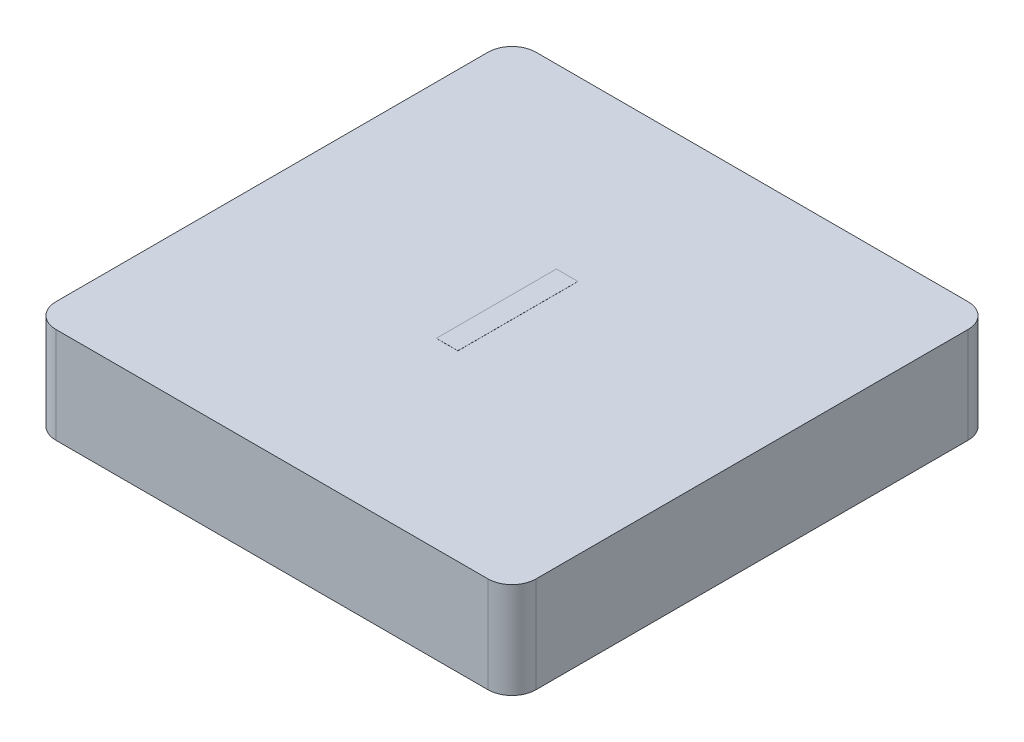
ISO-10303-21;
HEADER;
FILE_DESCRIPTION(('STEP AP214'),'2;1');
FILE_NAME('part.step','',(''),(''),'','','');
FILE_SCHEMA(('AUTOMOTIVE_DESIGN { 1 0 10303 214 1 1 1 1 }'));
ENDSEC;
DATA;
#1=APPLICATION_CONTEXT('core data for automotive mechanical design processes');
#2=APPLICATION_PROTOCOL_DEFINITION('international standard','automotive_design',2000,#1);
#3=PRODUCT_CONTEXT('',#1,'mechanical');
#4=PRODUCT('Part','Part','',(#3));
#5=PRODUCT_RELATED_PRODUCT_CATEGORY('part','',(#4));
#6=PRODUCT_DEFINITION_FORMATION('','',#4);
#7=PRODUCT_DEFINITION_CONTEXT('part definition',#1,'design');
#8=PRODUCT_DEFINITION('design','',#6,#7);
#9=PRODUCT_DEFINITION_SHAPE('','',#8);
#10=(LENGTH_UNIT() NAMED_UNIT(*) SI_UNIT(.MILLI.,.METRE.));
#11=(NAMED_UNIT(*) PLANE_ANGLE_UNIT() SI_UNIT($,.RADIAN.));
#12=(NAMED_UNIT(*) SI_UNIT($,.STERADIAN.) SOLID_ANGLE_UNIT());
#13=UNCERTAINTY_MEASURE_WITH_UNIT(LENGTH_MEASURE(1.E-05),#10,'distance_accuracy_value','');
#14=(GEOMETRIC_REPRESENTATION_CONTEXT(3) GLOBAL_UNCERTAINTY_ASSIGNED_CONTEXT((#13)) GLOBAL_UNIT_ASSIGNED_CONTEXT((#10,
#11,#12)) REPRESENTATION_CONTEXT('',''));
#15=CARTESIAN_POINT('',(0.,0.,0.));
#16=DIRECTION('',(0.,0.,1.));
#17=DIRECTION('',(1.,0.,0.));
#18=AXIS2_PLACEMENT_3D('',#15,#16,#17);
#19=CARTESIAN_POINT('',(0.,2.54,-12.7));
#20=DIRECTION('',(1.,0.,0.));
#21=DIRECTION('',(0.,0.,-1.));
#22=AXIS2_PLACEMENT_3D('',#19,#20,#21);
#23=PLANE('',#22);
#24=DIRECTION('',(0.,0.,1.));
#25=VECTOR('',#24,1.);
#26=CARTESIAN_POINT('',(0.,2.54,-12.7));
#27=LINE('',#26,#25);
#28=CARTESIAN_POINT('',(0.,2.54,-12.065));
#29=VERTEX_POINT('',#28);
#30=CARTESIAN_POINT('',(0.,2.54,-0.635));
#31=VERTEX_POINT('',#30);
#32=EDGE_CURVE('E223',#29,#31,#27,.T.);
#33=ORIENTED_EDGE('',*,*,#32,.F.);
#34=DIRECTION('',(0.,-1.,0.));
#35=VECTOR('',#34,1.);
#36=CARTESIAN_POINT('',(0.,2.54,-12.065));
#37=LINE('',#36,#35);
#38=CARTESIAN_POINT('',(0.,0.,-12.065));
#39=VERTEX_POINT('',#38);
#40=EDGE_CURVE('E248',#29,#39,#37,.T.);
#41=ORIENTED_EDGE('',*,*,#40,.T.);
#42=DIRECTION('',(0.,0.,1.));
#43=VECTOR('',#42,1.);
#44=CARTESIAN_POINT('',(0.,0.,-12.7));
#45=LINE('',#44,#43);
#46=CARTESIAN_POINT('',(0.,0.,-0.635));
#47=VERTEX_POINT('',#46);
#48=EDGE_CURVE('E203',#39,#47,#45,.T.);
#49=ORIENTED_EDGE('',*,*,#48,.T.);
#50=DIRECTION('',(0.,-1.,0.));
#51=VECTOR('',#50,1.);
#52=CARTESIAN_POINT('',(0.,2.54,-0.635));
#53=LINE('',#52,#51);
#54=EDGE_CURVE('E236',#47,#31,#53,.F.);
#55=ORIENTED_EDGE('',*,*,#54,.T.);
#56=EDGE_LOOP('',(#33,#41,#49,#55));
#57=FACE_BOUND('',#56,.T.);
#58=ADVANCED_FACE('F33',(#57),#23,.F.);
#59=CARTESIAN_POINT('',(0.,2.54,0.));
#60=DIRECTION('',(0.,0.,-1.));
#61=DIRECTION('',(-1.,0.,0.));
#62=AXIS2_PLACEMENT_3D('',#59,#60,#61);
#63=PLANE('',#62);
#64=DIRECTION('',(1.,0.,0.));
#65=VECTOR('',#64,1.);
#66=CARTESIAN_POINT('',(0.,0.,0.));
#67=LINE('',#66,#65);
#68=CARTESIAN_POINT('',(0.635,0.,0.));
#69=VERTEX_POINT('',#68);
#70=CARTESIAN_POINT('',(12.065,0.,0.));
#71=VERTEX_POINT('',#70);
#72=EDGE_CURVE('E239',#69,#71,#67,.T.);
#73=ORIENTED_EDGE('',*,*,#72,.T.);
#74=DIRECTION('',(0.,-1.,0.));
#75=VECTOR('',#74,1.);
#76=CARTESIAN_POINT('',(12.065,2.54,0.));
#77=LINE('',#76,#75);
#78=CARTESIAN_POINT('',(12.065,2.54,0.));
#79=VERTEX_POINT('',#78);
#80=EDGE_CURVE('E41',#71,#79,#77,.F.);
#81=ORIENTED_EDGE('',*,*,#80,.T.);
#82=DIRECTION('',(1.,0.,0.));
#83=VECTOR('',#82,1.);
#84=CARTESIAN_POINT('',(0.,2.54,0.));
#85=LINE('',#84,#83);
#86=CARTESIAN_POINT('',(0.635,2.54,0.));
#87=VERTEX_POINT('',#86);
#88=EDGE_CURVE('E226',#87,#79,#85,.T.);
#89=ORIENTED_EDGE('',*,*,#88,.F.);
#90=DIRECTION('',(0.,-1.,0.));
#91=VECTOR('',#90,1.);
#92=CARTESIAN_POINT('',(0.635,2.54,0.));
#93=LINE('',#92,#91);
#94=EDGE_CURVE('E277',#87,#69,#93,.T.);
#95=ORIENTED_EDGE('',*,*,#94,.T.);
#96=EDGE_LOOP('',(#73,#81,#89,#95));
#97=FACE_BOUND('',#96,.T.);
#98=ADVANCED_FACE('F282',(#97),#63,.F.);
#99=CARTESIAN_POINT('',(12.7,2.54,0.));
#100=DIRECTION('',(-1.,0.,0.));
#101=DIRECTION('',(0.,0.,1.));
#102=AXIS2_PLACEMENT_3D('',#99,#100,#101);
#103=PLANE('',#102);
#104=DIRECTION('',(0.,0.,-1.));
#105=VECTOR('',#104,1.);
#106=CARTESIAN_POINT('',(12.7,0.,0.));
#107=LINE('',#106,#105);
#108=CARTESIAN_POINT('',(12.7,0.,-0.635));
#109=VERTEX_POINT('',#108);
#110=CARTESIAN_POINT('',(12.7,0.,-12.065));
#111=VERTEX_POINT('',#110);
#112=EDGE_CURVE('E242',#109,#111,#107,.T.);
#113=ORIENTED_EDGE('',*,*,#112,.T.);
#114=DIRECTION('',(0.,-1.,0.));
#115=VECTOR('',#114,1.);
#116=CARTESIAN_POINT('',(12.7,2.54,-12.065));
#117=LINE('',#116,#115);
#118=CARTESIAN_POINT('',(12.7,2.54,-12.065));
#119=VERTEX_POINT('',#118);
#120=EDGE_CURVE('E275',#111,#119,#117,.F.);
#121=ORIENTED_EDGE('',*,*,#120,.T.);
#122=DIRECTION('',(0.,0.,-1.));
#123=VECTOR('',#122,1.);
#124=CARTESIAN_POINT('',(12.7,2.54,0.));
#125=LINE('',#124,#123);
#126=CARTESIAN_POINT('',(12.7,2.54,-0.635));
#127=VERTEX_POINT('',#126);
#128=EDGE_CURVE('E230',#127,#119,#125,.T.);
#129=ORIENTED_EDGE('',*,*,#128,.F.);
#130=DIRECTION('',(0.,-1.,0.));
#131=VECTOR('',#130,1.);
#132=CARTESIAN_POINT('',(12.7,2.54,-0.635));
#133=LINE('',#132,#131);
#134=EDGE_CURVE('E272',#127,#109,#133,.T.);
#135=ORIENTED_EDGE('',*,*,#134,.T.);
#136=EDGE_LOOP('',(#113,#121,#129,#135));
#137=FACE_BOUND('',#136,.T.);
#138=ADVANCED_FACE('F295',(#137),#103,.F.);
#139=CARTESIAN_POINT('',(12.7,2.54,-12.7));
#140=DIRECTION('',(0.,0.,1.));
#141=DIRECTION('',(1.,0.,0.));
#142=AXIS2_PLACEMENT_3D('',#139,#140,#141);
#143=PLANE('',#142);
#144=DIRECTION('',(-1.,0.,0.));
#145=VECTOR('',#144,1.);
#146=CARTESIAN_POINT('',(12.7,0.,-12.7));
#147=LINE('',#146,#145);
#148=CARTESIAN_POINT('',(12.065,0.,-12.7));
#149=VERTEX_POINT('',#148);
#150=CARTESIAN_POINT('',(0.634999999999995,0.,-12.7));
#151=VERTEX_POINT('',#150);
#152=EDGE_CURVE('E227',#149,#151,#147,.T.);
#153=ORIENTED_EDGE('',*,*,#152,.T.);
#154=DIRECTION('',(0.,-1.,0.));
#155=VECTOR('',#154,1.);
#156=CARTESIAN_POINT('',(0.634999999999995,2.54,-12.7));
#157=LINE('',#156,#155);
#158=CARTESIAN_POINT('',(0.634999999999995,2.54,-12.7));
#159=VERTEX_POINT('',#158);
#160=EDGE_CURVE('E262',#151,#159,#157,.F.);
#161=ORIENTED_EDGE('',*,*,#160,.T.);
#162=DIRECTION('',(-1.,0.,0.));
#163=VECTOR('',#162,1.);
#164=CARTESIAN_POINT('',(12.7,2.54,-12.7));
#165=LINE('',#164,#163);
#166=CARTESIAN_POINT('',(12.065,2.54,-12.7));
#167=VERTEX_POINT('',#166);
#168=EDGE_CURVE('E233',#167,#159,#165,.T.);
#169=ORIENTED_EDGE('',*,*,#168,.F.);
#170=DIRECTION('',(0.,-1.,0.));
#171=VECTOR('',#170,1.);
#172=CARTESIAN_POINT('',(12.065,2.54,-12.7));
#173=LINE('',#172,#171);
#174=EDGE_CURVE('E259',#167,#149,#173,.T.);
#175=ORIENTED_EDGE('',*,*,#174,.T.);
#176=EDGE_LOOP('',(#153,#161,#169,#175));
#177=FACE_BOUND('',#176,.T.);
#178=ADVANCED_FACE('F307',(#177),#143,.F.);
#179=CARTESIAN_POINT('',(0.,2.54,0.));
#180=DIRECTION('',(0.,1.,0.));
#181=DIRECTION('',(0.,0.,1.));
#182=AXIS2_PLACEMENT_3D('',#179,#180,#181);
#183=PLANE('',#182);
#184=DIRECTION('',(0.,0.,-1.));
#185=VECTOR('',#184,1.);
#186=CARTESIAN_POINT('',(5.87293589743589,2.54,-4.826));
#187=LINE('',#186,#185);
#188=CARTESIAN_POINT('',(5.87293589743589,2.54,-4.826));
#189=VERTEX_POINT('',#188);
#190=CARTESIAN_POINT('',(5.87293589743589,2.54,-8.001));
#191=VERTEX_POINT('',#190);
#192=EDGE_CURVE('E175',#189,#191,#187,.T.);
#193=ORIENTED_EDGE('',*,*,#192,.T.);
#194=DIRECTION('',(1.,0.,0.));
#195=VECTOR('',#194,1.);
#196=CARTESIAN_POINT('',(5.87293589743589,2.54,-8.001));
#197=LINE('',#196,#195);
#198=CARTESIAN_POINT('',(6.44280769230769,2.54,-8.001));
#199=VERTEX_POINT('',#198);
#200=EDGE_CURVE('E151',#191,#199,#197,.T.);
#201=ORIENTED_EDGE('',*,*,#200,.T.);
#202=DIRECTION('',(0.,0.,1.));
#203=VECTOR('',#202,1.);
#204=CARTESIAN_POINT('',(6.44280769230769,2.54,-8.001));
#205=LINE('',#204,#203);
#206=CARTESIAN_POINT('',(6.44280769230769,2.54,-4.826));
#207=VERTEX_POINT('',#206);
#208=EDGE_CURVE('E53',#199,#207,#205,.T.);
#209=ORIENTED_EDGE('',*,*,#208,.T.);
#210=DIRECTION('',(-1.,0.,0.));
#211=VECTOR('',#210,1.);
#212=CARTESIAN_POINT('',(6.44280769230769,2.54,-4.826));
#213=LINE('',#212,#211);
#214=EDGE_CURVE('E48',#207,#189,#213,.T.);
#215=ORIENTED_EDGE('',*,*,#214,.T.);
#216=EDGE_LOOP('',(#193,#201,#209,#215));
#217=FACE_BOUND('',#216,.T.);
#218=ORIENTED_EDGE('',*,*,#168,.T.);
#219=CARTESIAN_POINT('',(0.634999999999995,2.54,-12.065));
#220=DIRECTION('',(0.,1.,0.));
#221=DIRECTION('',(0.,0.,1.));
#222=AXIS2_PLACEMENT_3D('',#219,#220,#221);
#223=CIRCLE('',#222,0.635);
#224=EDGE_CURVE('E270',#159,#29,#223,.T.);
#225=ORIENTED_EDGE('',*,*,#224,.T.);
#226=ORIENTED_EDGE('',*,*,#32,.T.);
#227=CARTESIAN_POINT('',(0.635,2.54,-0.635));
#228=DIRECTION('',(0.,1.,0.));
#229=DIRECTION('',(0.,0.,1.));
#230=AXIS2_PLACEMENT_3D('',#227,#228,#229);
#231=CIRCLE('',#230,0.635);
#232=EDGE_CURVE('E264',#31,#87,#231,.T.);
#233=ORIENTED_EDGE('',*,*,#232,.T.);
#234=ORIENTED_EDGE('',*,*,#88,.T.);
#235=CARTESIAN_POINT('',(12.065,2.54,-0.635));
#236=DIRECTION('',(0.,1.,0.));
#237=DIRECTION('',(0.,0.,1.));
#238=AXIS2_PLACEMENT_3D('',#235,#236,#237);
#239=CIRCLE('',#238,0.635);
#240=EDGE_CURVE('E266',#79,#127,#239,.T.);
#241=ORIENTED_EDGE('',*,*,#240,.T.);
#242=ORIENTED_EDGE('',*,*,#128,.T.);
#243=CARTESIAN_POINT('',(12.065,2.54,-12.065));
#244=DIRECTION('',(0.,1.,0.));
#245=DIRECTION('',(0.,0.,1.));
#246=AXIS2_PLACEMENT_3D('',#243,#244,#245);
#247=CIRCLE('',#246,0.635);
#248=EDGE_CURVE('E268',#119,#167,#247,.T.);
#249=ORIENTED_EDGE('',*,*,#248,.T.);
#250=EDGE_LOOP('',(#218,#225,#226,#233,#234,#241,#242,#249));
#251=FACE_BOUND('',#250,.T.);
#252=ADVANCED_FACE('F288',(#217,#251),#183,.T.);
#253=CARTESIAN_POINT('',(0.,0.,0.));
#254=DIRECTION('',(0.,1.,0.));
#255=DIRECTION('',(0.,0.,1.));
#256=AXIS2_PLACEMENT_3D('',#253,#254,#255);
#257=PLANE('',#256);
#258=DIRECTION('',(-1.,0.,0.));
#259=VECTOR('',#258,1.);
#260=CARTESIAN_POINT('',(12.7,0.,-12.065));
#261=LINE('',#260,#259);
#262=CARTESIAN_POINT('',(12.065,0.,-12.065));
#263=VERTEX_POINT('',#262);
#264=CARTESIAN_POINT('',(0.634999999999995,0.,-12.065));
#265=VERTEX_POINT('',#264);
#266=EDGE_CURVE('E191',#263,#265,#261,.T.);
#267=ORIENTED_EDGE('',*,*,#266,.T.);
#268=DIRECTION('',(0.,0.,1.));
#269=VECTOR('',#268,1.);
#270=CARTESIAN_POINT('',(0.634999999999995,0.,-12.7));
#271=LINE('',#270,#269);
#272=CARTESIAN_POINT('',(0.635,0.,-0.635));
#273=VERTEX_POINT('',#272);
#274=EDGE_CURVE('E186',#265,#273,#271,.T.);
#275=ORIENTED_EDGE('',*,*,#274,.T.);
#276=DIRECTION('',(1.,0.,0.));
#277=VECTOR('',#276,1.);
#278=CARTESIAN_POINT('',(0.,0.,-0.635));
#279=LINE('',#278,#277);
#280=CARTESIAN_POINT('',(12.065,0.,-0.635));
#281=VERTEX_POINT('',#280);
#282=EDGE_CURVE('E215',#273,#281,#279,.T.);
#283=ORIENTED_EDGE('',*,*,#282,.T.);
#284=DIRECTION('',(0.,0.,-1.));
#285=VECTOR('',#284,1.);
#286=CARTESIAN_POINT('',(12.065,0.,0.));
#287=LINE('',#286,#285);
#288=EDGE_CURVE('E218',#281,#263,#287,.T.);
#289=ORIENTED_EDGE('',*,*,#288,.T.);
#290=EDGE_LOOP('',(#267,#275,#283,#289));
#291=FACE_BOUND('',#290,.T.);
#292=ORIENTED_EDGE('',*,*,#48,.F.);
#293=CARTESIAN_POINT('',(0.634999999999995,0.,-12.065));
#294=DIRECTION('',(0.,1.,0.));
#295=DIRECTION('',(0.,0.,1.));
#296=AXIS2_PLACEMENT_3D('',#293,#294,#295);
#297=CIRCLE('',#296,0.635);
#298=EDGE_CURVE('E257',#39,#151,#297,.F.);
#299=ORIENTED_EDGE('',*,*,#298,.T.);
#300=ORIENTED_EDGE('',*,*,#152,.F.);
#301=CARTESIAN_POINT('',(12.065,0.,-12.065));
#302=DIRECTION('',(0.,1.,0.));
#303=DIRECTION('',(0.,0.,1.));
#304=AXIS2_PLACEMENT_3D('',#301,#302,#303);
#305=CIRCLE('',#304,0.635);
#306=EDGE_CURVE('E255',#149,#111,#305,.F.);
#307=ORIENTED_EDGE('',*,*,#306,.T.);
#308=ORIENTED_EDGE('',*,*,#112,.F.);
#309=CARTESIAN_POINT('',(12.065,0.,-0.635));
#310=DIRECTION('',(0.,1.,0.));
#311=DIRECTION('',(0.,0.,1.));
#312=AXIS2_PLACEMENT_3D('',#309,#310,#311);
#313=CIRCLE('',#312,0.635);
#314=EDGE_CURVE('E253',#109,#71,#313,.F.);
#315=ORIENTED_EDGE('',*,*,#314,.T.);
#316=ORIENTED_EDGE('',*,*,#72,.F.);
#317=CARTESIAN_POINT('',(0.635,0.,-0.635));
#318=DIRECTION('',(0.,1.,0.));
#319=DIRECTION('',(0.,0.,1.));
#320=AXIS2_PLACEMENT_3D('',#317,#318,#319);
#321=CIRCLE('',#320,0.635);
#322=EDGE_CURVE('E251',#69,#47,#321,.F.);
#323=ORIENTED_EDGE('',*,*,#322,.T.);
#324=EDGE_LOOP('',(#292,#299,#300,#307,#308,#315,#316,#323));
#325=FACE_BOUND('',#324,.T.);
#326=ADVANCED_FACE('F299',(#291,#325),#257,.F.);
#327=CARTESIAN_POINT('',(0.634999999999995,2.54,-12.065));
#328=DIRECTION('',(0.,-1.,0.));
#329=DIRECTION('',(0.,0.,-1.));
#330=AXIS2_PLACEMENT_3D('',#327,#328,#329);
#331=CYLINDRICAL_SURFACE('',#330,0.635);
#332=ORIENTED_EDGE('',*,*,#224,.F.);
#333=ORIENTED_EDGE('',*,*,#160,.F.);
#334=ORIENTED_EDGE('',*,*,#298,.F.);
#335=ORIENTED_EDGE('',*,*,#40,.F.);
#336=EDGE_LOOP('',(#332,#333,#334,#335));
#337=FACE_BOUND('',#336,.T.);
#338=ADVANCED_FACE('F313',(#337),#331,.T.);
#339=CARTESIAN_POINT('',(12.065,2.54,-12.065));
#340=DIRECTION('',(0.,-1.,0.));
#341=DIRECTION('',(0.,0.,-1.));
#342=AXIS2_PLACEMENT_3D('',#339,#340,#341);
#343=CYLINDRICAL_SURFACE('',#342,0.635);
#344=ORIENTED_EDGE('',*,*,#248,.F.);
#345=ORIENTED_EDGE('',*,*,#120,.F.);
#346=ORIENTED_EDGE('',*,*,#306,.F.);
#347=ORIENTED_EDGE('',*,*,#174,.F.);
#348=EDGE_LOOP('',(#344,#345,#346,#347));
#349=FACE_BOUND('',#348,.T.);
#350=ADVANCED_FACE('F304',(#349),#343,.T.);
#351=CARTESIAN_POINT('',(12.065,2.54,-0.635));
#352=DIRECTION('',(0.,-1.,0.));
#353=DIRECTION('',(0.,0.,-1.));
#354=AXIS2_PLACEMENT_3D('',#351,#352,#353);
#355=CYLINDRICAL_SURFACE('',#354,0.635);
#356=ORIENTED_EDGE('',*,*,#240,.F.);
#357=ORIENTED_EDGE('',*,*,#80,.F.);
#358=ORIENTED_EDGE('',*,*,#314,.F.);
#359=ORIENTED_EDGE('',*,*,#134,.F.);
#360=EDGE_LOOP('',(#356,#357,#358,#359));
#361=FACE_BOUND('',#360,.T.);
#362=ADVANCED_FACE('F292',(#361),#355,.T.);
#363=CARTESIAN_POINT('',(0.635,2.54,-0.635));
#364=DIRECTION('',(0.,-1.,0.));
#365=DIRECTION('',(0.,0.,-1.));
#366=AXIS2_PLACEMENT_3D('',#363,#364,#365);
#367=CYLINDRICAL_SURFACE('',#366,0.635);
#368=ORIENTED_EDGE('',*,*,#232,.F.);
#369=ORIENTED_EDGE('',*,*,#54,.F.);
#370=ORIENTED_EDGE('',*,*,#322,.F.);
#371=ORIENTED_EDGE('',*,*,#94,.F.);
#372=EDGE_LOOP('',(#368,#369,#370,#371));
#373=FACE_BOUND('',#372,.T.);
#374=ADVANCED_FACE('F35',(#373),#367,.T.);
#375=CARTESIAN_POINT('',(0.634999999999995,2.54,-12.7));
#376=DIRECTION('',(1.,0.,0.));
#377=DIRECTION('',(0.,0.,-1.));
#378=AXIS2_PLACEMENT_3D('',#375,#376,#377);
#379=PLANE('',#378);
#380=DIRECTION('',(0.,0.,1.));
#381=VECTOR('',#380,1.);
#382=CARTESIAN_POINT('',(0.634999999999995,1.905,-12.7));
#383=LINE('',#382,#381);
#384=CARTESIAN_POINT('',(0.634999999999995,1.905,-12.065));
#385=VERTEX_POINT('',#384);
#386=CARTESIAN_POINT('',(0.635,1.905,-0.635));
#387=VERTEX_POINT('',#386);
#388=EDGE_CURVE('E187',#385,#387,#383,.T.);
#389=ORIENTED_EDGE('',*,*,#388,.T.);
#390=DIRECTION('',(0.,1.,0.));
#391=VECTOR('',#390,1.);
#392=CARTESIAN_POINT('',(0.635,2.54,-0.635));
#393=LINE('',#392,#391);
#394=EDGE_CURVE('E196',#273,#387,#393,.T.);
#395=ORIENTED_EDGE('',*,*,#394,.F.);
#396=ORIENTED_EDGE('',*,*,#274,.F.);
#397=DIRECTION('',(0.,1.,0.));
#398=VECTOR('',#397,1.);
#399=CARTESIAN_POINT('',(0.634999999999995,2.54,-12.065));
#400=LINE('',#399,#398);
#401=EDGE_CURVE('E192',#265,#385,#400,.T.);
#402=ORIENTED_EDGE('',*,*,#401,.T.);
#403=EDGE_LOOP('',(#389,#395,#396,#402));
#404=FACE_BOUND('',#403,.T.);
#405=ADVANCED_FACE('F318',(#404),#379,.T.);
#406=CARTESIAN_POINT('',(0.,2.54,-0.635));
#407=DIRECTION('',(0.,0.,-1.));
#408=DIRECTION('',(-1.,0.,0.));
#409=AXIS2_PLACEMENT_3D('',#406,#407,#408);
#410=PLANE('',#409);
#411=ORIENTED_EDGE('',*,*,#282,.F.);
#412=ORIENTED_EDGE('',*,*,#394,.T.);
#413=DIRECTION('',(1.,0.,0.));
#414=VECTOR('',#413,1.);
#415=CARTESIAN_POINT('',(0.,1.905,-0.635));
#416=LINE('',#415,#414);
#417=CARTESIAN_POINT('',(12.065,1.905,-0.635));
#418=VERTEX_POINT('',#417);
#419=EDGE_CURVE('E190',#387,#418,#416,.T.);
#420=ORIENTED_EDGE('',*,*,#419,.T.);
#421=DIRECTION('',(0.,1.,0.));
#422=VECTOR('',#421,1.);
#423=CARTESIAN_POINT('',(12.065,2.54,-0.635));
#424=LINE('',#423,#422);
#425=EDGE_CURVE('E200',#281,#418,#424,.T.);
#426=ORIENTED_EDGE('',*,*,#425,.F.);
#427=EDGE_LOOP('',(#411,#412,#420,#426));
#428=FACE_BOUND('',#427,.T.);
#429=ADVANCED_FACE('F323',(#428),#410,.T.);
#430=CARTESIAN_POINT('',(12.065,2.54,0.));
#431=DIRECTION('',(-1.,0.,0.));
#432=DIRECTION('',(0.,0.,1.));
#433=AXIS2_PLACEMENT_3D('',#430,#431,#432);
#434=PLANE('',#433);
#435=ORIENTED_EDGE('',*,*,#288,.F.);
#436=ORIENTED_EDGE('',*,*,#425,.T.);
#437=DIRECTION('',(0.,0.,-1.));
#438=VECTOR('',#437,1.);
#439=CARTESIAN_POINT('',(12.065,1.905,0.));
#440=LINE('',#439,#438);
#441=CARTESIAN_POINT('',(12.065,1.905,-12.065));
#442=VERTEX_POINT('',#441);
#443=EDGE_CURVE('E206',#418,#442,#440,.T.);
#444=ORIENTED_EDGE('',*,*,#443,.T.);
#445=DIRECTION('',(0.,1.,0.));
#446=VECTOR('',#445,1.);
#447=CARTESIAN_POINT('',(12.065,2.54,-12.065));
#448=LINE('',#447,#446);
#449=EDGE_CURVE('E195',#263,#442,#448,.T.);
#450=ORIENTED_EDGE('',*,*,#449,.F.);
#451=EDGE_LOOP('',(#435,#436,#444,#450));
#452=FACE_BOUND('',#451,.T.);
#453=ADVANCED_FACE('F376',(#452),#434,.T.);
#454=CARTESIAN_POINT('',(12.7,2.54,-12.065));
#455=DIRECTION('',(0.,0.,1.));
#456=DIRECTION('',(1.,0.,0.));
#457=AXIS2_PLACEMENT_3D('',#454,#455,#456);
#458=PLANE('',#457);
#459=ORIENTED_EDGE('',*,*,#266,.F.);
#460=ORIENTED_EDGE('',*,*,#449,.T.);
#461=DIRECTION('',(-1.,0.,0.));
#462=VECTOR('',#461,1.);
#463=CARTESIAN_POINT('',(12.7,1.905,-12.065));
#464=LINE('',#463,#462);
#465=EDGE_CURVE('E199',#442,#385,#464,.T.);
#466=ORIENTED_EDGE('',*,*,#465,.T.);
#467=ORIENTED_EDGE('',*,*,#401,.F.);
#468=EDGE_LOOP('',(#459,#460,#466,#467));
#469=FACE_BOUND('',#468,.T.);
#470=ADVANCED_FACE('F386',(#469),#458,.T.);
#471=CARTESIAN_POINT('',(0.,1.905,0.));
#472=DIRECTION('',(0.,1.,0.));
#473=DIRECTION('',(0.,0.,1.));
#474=AXIS2_PLACEMENT_3D('',#471,#472,#473);
#475=PLANE('',#474);
#476=CARTESIAN_POINT('',(6.34999999999999,1.905,-6.35));
#477=DIRECTION('',(0.,1.,0.));
#478=DIRECTION('',(0.,0.,1.));
#479=AXIS2_PLACEMENT_3D('',#476,#477,#478);
#480=CIRCLE('',#479,2.54);
#481=CARTESIAN_POINT('',(6.34999999999999,1.905,-3.81));
#482=VERTEX_POINT('',#481);
#483=EDGE_CURVE('E11',#482,#482,#480,.F.);
#484=ORIENTED_EDGE('',*,*,#483,.F.);
#485=EDGE_LOOP('',(#484));
#486=FACE_BOUND('',#485,.T.);
#487=ORIENTED_EDGE('',*,*,#465,.F.);
#488=ORIENTED_EDGE('',*,*,#443,.F.);
#489=ORIENTED_EDGE('',*,*,#419,.F.);
#490=ORIENTED_EDGE('',*,*,#388,.F.);
#491=EDGE_LOOP('',(#487,#488,#489,#490));
#492=FACE_BOUND('',#491,.T.);
#493=ADVANCED_FACE('F396',(#486,#492),#475,.F.);
#494=CARTESIAN_POINT('',(6.34999999999999,-7.18420489685532,-6.35));
#495=DIRECTION('',(0.,1.,0.));
#496=DIRECTION('',(0.,0.,1.));
#497=AXIS2_PLACEMENT_3D('',#494,#495,#496);
#498=CYLINDRICAL_SURFACE('',#497,2.54);
#499=CARTESIAN_POINT('',(6.34999999999999,0.,-6.35));
#500=DIRECTION('',(0.,1.,0.));
#501=DIRECTION('',(0.,0.,1.));
#502=AXIS2_PLACEMENT_3D('',#499,#500,#501);
#503=CIRCLE('',#502,2.54);
#504=CARTESIAN_POINT('',(6.34999999999999,0.,-3.81));
#505=VERTEX_POINT('',#504);
#506=EDGE_CURVE('E180',#505,#505,#503,.T.);
#507=CARTESIAN_POINT('',(6.34999999999999,0.,-3.81));
#508=CARTESIAN_POINT('',(6.34999999999999,0.0198437499999991,-3.81));
#509=CARTESIAN_POINT('',(6.34999999999999,0.0396874999999989,-3.81));
#510=CARTESIAN_POINT('',(6.34999999999999,0.079374999999999,-3.81));
#511=CARTESIAN_POINT('',(6.34999999999999,0.0992187499999992,-3.81));
#512=CARTESIAN_POINT('',(6.34999999999999,0.138906249999999,-3.81));
#513=CARTESIAN_POINT('',(6.34999999999999,0.158749999999999,-3.81));
#514=CARTESIAN_POINT('',(6.34999999999999,0.198437499999999,-3.81));
#515=CARTESIAN_POINT('',(6.34999999999999,0.218281249999999,-3.81));
#516=CARTESIAN_POINT('',(6.34999999999999,0.25796875,-3.81));
#517=CARTESIAN_POINT('',(6.34999999999999,0.277812499999999,-3.81));
#518=CARTESIAN_POINT('',(6.34999999999999,0.317499999999999,-3.81));
#519=CARTESIAN_POINT('',(6.34999999999999,0.337343749999999,-3.81));
#520=CARTESIAN_POINT('',(6.34999999999999,0.377031249999999,-3.81));
#521=CARTESIAN_POINT('',(6.34999999999999,0.396874999999999,-3.81));
#522=CARTESIAN_POINT('',(6.34999999999999,0.436562499999999,-3.81));
#523=CARTESIAN_POINT('',(6.34999999999999,0.456406249999999,-3.81));
#524=CARTESIAN_POINT('',(6.34999999999999,0.496093749999999,-3.81));
#525=CARTESIAN_POINT('',(6.34999999999999,0.515937499999999,-3.81));
#526=CARTESIAN_POINT('',(6.34999999999999,0.555624999999999,-3.81));
#527=CARTESIAN_POINT('',(6.34999999999999,0.575468749999999,-3.81));
#528=CARTESIAN_POINT('',(6.34999999999999,0.615156249999999,-3.81));
#529=CARTESIAN_POINT('',(6.34999999999999,0.634999999999999,-3.81));
#530=CARTESIAN_POINT('',(6.34999999999999,0.674687499999998,-3.81));
#531=CARTESIAN_POINT('',(6.34999999999999,0.694531249999998,-3.81));
#532=CARTESIAN_POINT('',(6.34999999999999,0.734218749999998,-3.81));
#533=CARTESIAN_POINT('',(6.34999999999999,0.754062499999998,-3.81));
#534=CARTESIAN_POINT('',(6.34999999999999,0.793749999999998,-3.81));
#535=CARTESIAN_POINT('',(6.34999999999999,0.813593749999999,-3.81));
#536=CARTESIAN_POINT('',(6.34999999999999,0.853281249999999,-3.81));
#537=CARTESIAN_POINT('',(6.34999999999999,0.873124999999999,-3.81));
#538=CARTESIAN_POINT('',(6.34999999999999,0.912812499999999,-3.81));
#539=CARTESIAN_POINT('',(6.34999999999999,0.932656249999999,-3.81));
#540=CARTESIAN_POINT('',(6.34999999999999,0.972343749999998,-3.81));
#541=CARTESIAN_POINT('',(6.34999999999999,0.992187499999998,-3.81));
#542=CARTESIAN_POINT('',(6.34999999999999,1.031875,-3.81));
#543=CARTESIAN_POINT('',(6.34999999999999,1.05171875,-3.81));
#544=CARTESIAN_POINT('',(6.34999999999999,1.09140625,-3.81));
#545=CARTESIAN_POINT('',(6.34999999999999,1.11125,-3.81));
#546=CARTESIAN_POINT('',(6.34999999999999,1.1509375,-3.81));
#547=CARTESIAN_POINT('',(6.34999999999999,1.17078125,-3.81));
#548=CARTESIAN_POINT('',(6.34999999999999,1.21046875,-3.81));
#549=CARTESIAN_POINT('',(6.34999999999999,1.2303125,-3.81));
#550=CARTESIAN_POINT('',(6.34999999999999,1.27,-3.81));
#551=CARTESIAN_POINT('',(6.34999999999999,1.28984375,-3.81));
#552=CARTESIAN_POINT('',(6.34999999999999,1.32953125,-3.81));
#553=CARTESIAN_POINT('',(6.34999999999999,1.349375,-3.81));
#554=CARTESIAN_POINT('',(6.34999999999999,1.3890625,-3.81));
#555=CARTESIAN_POINT('',(6.34999999999999,1.40890625,-3.81));
#556=CARTESIAN_POINT('',(6.34999999999999,1.44859375,-3.81));
#557=CARTESIAN_POINT('',(6.34999999999999,1.4684375,-3.81));
#558=CARTESIAN_POINT('',(6.34999999999999,1.508125,-3.81));
#559=CARTESIAN_POINT('',(6.34999999999999,1.52796875,-3.81));
#560=CARTESIAN_POINT('',(6.34999999999999,1.56765625,-3.81));
#561=CARTESIAN_POINT('',(6.34999999999999,1.5875,-3.81));
#562=CARTESIAN_POINT('',(6.34999999999999,1.6271875,-3.81));
#563=CARTESIAN_POINT('',(6.34999999999999,1.64703125,-3.81));
#564=CARTESIAN_POINT('',(6.34999999999999,1.68671875,-3.81));
#565=CARTESIAN_POINT('',(6.34999999999999,1.7065625,-3.81));
#566=CARTESIAN_POINT('',(6.34999999999999,1.74625,-3.81));
#567=CARTESIAN_POINT('',(6.34999999999999,1.76609375,-3.81));
#568=CARTESIAN_POINT('',(6.34999999999999,1.80578125,-3.81));
#569=CARTESIAN_POINT('',(6.34999999999999,1.825625,-3.81));
#570=CARTESIAN_POINT('',(6.34999999999999,1.8653125,-3.81));
#571=CARTESIAN_POINT('',(6.34999999999999,1.88515625,-3.81));
#572=CARTESIAN_POINT('',(6.34999999999999,1.905,-3.81));
#573=B_SPLINE_CURVE_WITH_KNOTS('',3,(#507,#508,#509,#510,#511,#512,#513,#514,#515,#516,#517,
#518,#519,#520,#521,#522,#523,#524,#525,#526,#527,#528,#529,#530,#531,#532,#533,#534,#535,#536,
#537,#538,#539,#540,#541,#542,#543,#544,#545,#546,#547,#548,#549,#550,#551,#552,#553,#554,#555,
#556,#557,#558,#559,#560,#561,#562,#563,#564,#565,#566,#567,#568,#569,#570,#571,#572),
.UNSPECIFIED.,.F.,.F.,(4,2,2,2,2,2,2,2,2,2,2,2,2,2,2,2,2,2,2,2,2,2,2,2,2,2,2,2,2,2,2,2,4),(0.,
0.0595312499999997,0.1190625,0.17859375,0.238125,0.29765625,0.3571875,0.41671875,0.47625,
0.53578125,0.5953125,0.654843749999999,0.714374999999999,0.773906249999999,0.8334375,0.89296875,
0.952499999999999,1.01203125,1.0715625,1.13109375,1.190625,1.25015625,1.3096875,1.36921875,
1.42875,1.48828125,1.5478125,1.60734375,1.666875,1.72640625,1.7859375,1.84546875,1.905),.UNSPECIFIED.);
#574=EDGE_CURVE('BSEAM406',#505,#482,#573,.T.);
#575=ORIENTED_EDGE('',*,*,#506,.T.);
#576=ORIENTED_EDGE('',*,*,#483,.T.);
#577=ORIENTED_EDGE('',*,*,#574,.T.);
#578=ORIENTED_EDGE('',*,*,#574,.F.);
#579=EDGE_LOOP('',(#575,#577,#576,#578));
#580=FACE_BOUND('',#579,.T.);
#581=ADVANCED_FACE('F406',(#580),#498,.T.);
#582=CARTESIAN_POINT('',(0.,0.,0.));
#583=DIRECTION('',(0.,1.,0.));
#584=DIRECTION('',(0.,0.,1.));
#585=AXIS2_PLACEMENT_3D('',#582,#583,#584);
#586=PLANE('',#585);
#587=ORIENTED_EDGE('',*,*,#506,.F.);
#588=EDGE_LOOP('',(#587));
#589=FACE_BOUND('',#588,.T.);
#590=ADVANCED_FACE('F416',(#589),#586,.F.);
#591=CARTESIAN_POINT('',(5.87293589743589,2.54254,-4.826));
#592=DIRECTION('',(-1.,0.,0.));
#593=DIRECTION('',(0.,0.,1.));
#594=AXIS2_PLACEMENT_3D('',#591,#592,#593);
#595=PLANE('',#594);
#596=ORIENTED_EDGE('',*,*,#192,.F.);
#597=DIRECTION('',(0.,-1.,0.));
#598=VECTOR('',#597,1.);
#599=CARTESIAN_POINT('',(5.87293589743589,2.54254,-4.826));
#600=LINE('',#599,#598);
#601=CARTESIAN_POINT('',(5.87293589743589,2.54254,-4.826));
#602=VERTEX_POINT('',#601);
#603=EDGE_CURVE('E169',#602,#189,#600,.T.);
#604=ORIENTED_EDGE('',*,*,#603,.F.);
#605=DIRECTION('',(0.,0.,-1.));
#606=VECTOR('',#605,1.);
#607=CARTESIAN_POINT('',(5.87293589743589,2.54254,-4.826));
#608=LINE('',#607,#606);
#609=CARTESIAN_POINT('',(5.87293589743589,2.54254,-8.001));
#610=VERTEX_POINT('',#609);
#611=EDGE_CURVE('E163',#602,#610,#608,.T.);
#612=ORIENTED_EDGE('',*,*,#611,.T.);
#613=DIRECTION('',(0.,-1.,0.));
#614=VECTOR('',#613,1.);
#615=CARTESIAN_POINT('',(5.87293589743589,2.54254,-8.001));
#616=LINE('',#615,#614);
#617=EDGE_CURVE('E146',#610,#191,#616,.T.);
#618=ORIENTED_EDGE('',*,*,#617,.T.);
#619=EDGE_LOOP('',(#596,#604,#612,#618));
#620=FACE_BOUND('',#619,.T.);
#621=ADVANCED_FACE('F168',(#620),#595,.T.);
#622=CARTESIAN_POINT('',(6.44280769230769,2.54254,-4.826));
#623=DIRECTION('',(0.,0.,1.));
#624=DIRECTION('',(1.,0.,0.));
#625=AXIS2_PLACEMENT_3D('',#622,#623,#624);
#626=PLANE('',#625);
#627=ORIENTED_EDGE('',*,*,#214,.F.);
#628=DIRECTION('',(0.,-1.,0.));
#629=VECTOR('',#628,1.);
#630=CARTESIAN_POINT('',(6.44280769230769,2.54254,-4.826));
#631=LINE('',#630,#629);
#632=CARTESIAN_POINT('',(6.44280769230769,2.54254,-4.826));
#633=VERTEX_POINT('',#632);
#634=EDGE_CURVE('E181',#633,#207,#631,.T.);
#635=ORIENTED_EDGE('',*,*,#634,.F.);
#636=DIRECTION('',(-1.,0.,0.));
#637=VECTOR('',#636,1.);
#638=CARTESIAN_POINT('',(6.44280769230769,2.54254,-4.826));
#639=LINE('',#638,#637);
#640=EDGE_CURVE('E156',#633,#602,#639,.T.);
#641=ORIENTED_EDGE('',*,*,#640,.T.);
#642=ORIENTED_EDGE('',*,*,#603,.T.);
#643=EDGE_LOOP('',(#627,#635,#641,#642));
#644=FACE_BOUND('',#643,.T.);
#645=ADVANCED_FACE('F443',(#644),#626,.T.);
#646=CARTESIAN_POINT('',(6.44280769230769,2.54254,-8.001));
#647=DIRECTION('',(1.,0.,0.));
#648=DIRECTION('',(0.,0.,-1.));
#649=AXIS2_PLACEMENT_3D('',#646,#647,#648);
#650=PLANE('',#649);
#651=ORIENTED_EDGE('',*,*,#208,.F.);
#652=DIRECTION('',(0.,-1.,0.));
#653=VECTOR('',#652,1.);
#654=CARTESIAN_POINT('',(6.44280769230769,2.54254,-8.001));
#655=LINE('',#654,#653);
#656=CARTESIAN_POINT('',(6.44280769230769,2.54254,-8.001));
#657=VERTEX_POINT('',#656);
#658=EDGE_CURVE('E155',#657,#199,#655,.T.);
#659=ORIENTED_EDGE('',*,*,#658,.F.);
#660=DIRECTION('',(0.,0.,1.));
#661=VECTOR('',#660,1.);
#662=CARTESIAN_POINT('',(6.44280769230769,2.54254,-8.001));
#663=LINE('',#662,#661);
#664=EDGE_CURVE('E166',#657,#633,#663,.T.);
#665=ORIENTED_EDGE('',*,*,#664,.T.);
#666=ORIENTED_EDGE('',*,*,#634,.T.);
#667=EDGE_LOOP('',(#651,#659,#665,#666));
#668=FACE_BOUND('',#667,.T.);
#669=ADVANCED_FACE('F452',(#668),#650,.T.);
#670=CARTESIAN_POINT('',(5.87293589743589,2.54254,-8.001));
#671=DIRECTION('',(0.,0.,-1.));
#672=DIRECTION('',(-1.,0.,0.));
#673=AXIS2_PLACEMENT_3D('',#670,#671,#672);
#674=PLANE('',#673);
#675=ORIENTED_EDGE('',*,*,#200,.F.);
#676=ORIENTED_EDGE('',*,*,#617,.F.);
#677=DIRECTION('',(1.,0.,0.));
#678=VECTOR('',#677,1.);
#679=CARTESIAN_POINT('',(5.87293589743589,2.54254,-8.001));
#680=LINE('',#679,#678);
#681=EDGE_CURVE('E150',#610,#657,#680,.T.);
#682=ORIENTED_EDGE('',*,*,#681,.T.);
#683=ORIENTED_EDGE('',*,*,#658,.T.);
#684=EDGE_LOOP('',(#675,#676,#682,#683));
#685=FACE_BOUND('',#684,.T.);
#686=ADVANCED_FACE('F148',(#685),#674,.T.);
#687=CARTESIAN_POINT('',(0.,2.54254,0.));
#688=DIRECTION('',(0.,-1.,0.));
#689=DIRECTION('',(0.,0.,-1.));
#690=AXIS2_PLACEMENT_3D('',#687,#688,#689);
#691=PLANE('',#690);
#692=ORIENTED_EDGE('',*,*,#611,.F.);
#693=ORIENTED_EDGE('',*,*,#640,.F.);
#694=ORIENTED_EDGE('',*,*,#664,.F.);
#695=ORIENTED_EDGE('',*,*,#681,.F.);
#696=EDGE_LOOP('',(#692,#693,#694,#695));
#697=FACE_BOUND('',#696,.T.);
#698=ADVANCED_FACE('F161',(#697),#691,.F.);
#699=CLOSED_SHELL('',(#58,#98,#138,#178,#252,#326,#338,#350,#362,#374,#405,#429,#453,#470,#493,
#581,#590,#621,#645,#669,#686,#698));
#700=MANIFOLD_SOLID_BREP('B2',#699);
#701=ADVANCED_BREP_SHAPE_REPRESENTATION('',(#18,#700),#14);
#702=SHAPE_DEFINITION_REPRESENTATION(#9,#701);
ENDSEC;
END-ISO-10303-21;
